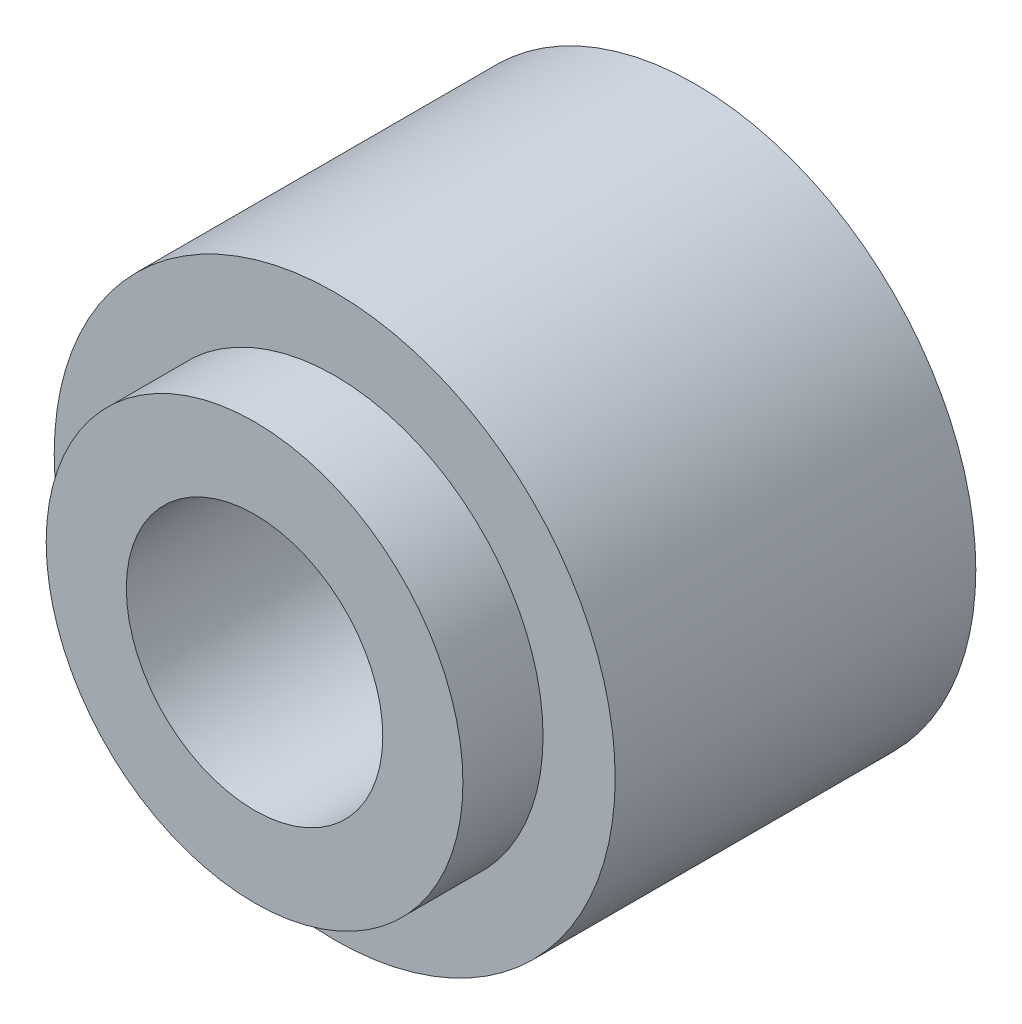
ISO-10303-21;
HEADER;
FILE_DESCRIPTION(('STEP AP214'),'2;1');
FILE_NAME('part.step','',(''),(''),'','','');
FILE_SCHEMA(('AUTOMOTIVE_DESIGN { 1 0 10303 214 1 1 1 1 }'));
ENDSEC;
DATA;
#1=APPLICATION_CONTEXT('core data for automotive mechanical design processes');
#2=APPLICATION_PROTOCOL_DEFINITION('international standard','automotive_design',2000,#1);
#3=PRODUCT_CONTEXT('',#1,'mechanical');
#4=PRODUCT('Part','Part','',(#3));
#5=PRODUCT_RELATED_PRODUCT_CATEGORY('part','',(#4));
#6=PRODUCT_DEFINITION_FORMATION('','',#4);
#7=PRODUCT_DEFINITION_CONTEXT('part definition',#1,'design');
#8=PRODUCT_DEFINITION('design','',#6,#7);
#9=PRODUCT_DEFINITION_SHAPE('','',#8);
#10=(LENGTH_UNIT() NAMED_UNIT(*) SI_UNIT(.MILLI.,.METRE.));
#11=(NAMED_UNIT(*) PLANE_ANGLE_UNIT() SI_UNIT($,.RADIAN.));
#12=(NAMED_UNIT(*) SI_UNIT($,.STERADIAN.) SOLID_ANGLE_UNIT());
#13=UNCERTAINTY_MEASURE_WITH_UNIT(LENGTH_MEASURE(1.E-05),#10,'distance_accuracy_value','');
#14=(GEOMETRIC_REPRESENTATION_CONTEXT(3) GLOBAL_UNCERTAINTY_ASSIGNED_CONTEXT((#13)) GLOBAL_UNIT_ASSIGNED_CONTEXT((#10,
#11,#12)) REPRESENTATION_CONTEXT('',''));
#15=CARTESIAN_POINT('',(0.,0.,0.));
#16=DIRECTION('',(0.,0.,1.));
#17=DIRECTION('',(1.,0.,0.));
#18=AXIS2_PLACEMENT_3D('',#15,#16,#17);
#19=CARTESIAN_POINT('',(0.,0.,5.5));
#20=DIRECTION('',(0.,0.,1.));
#21=DIRECTION('',(1.,0.,0.));
#22=AXIS2_PLACEMENT_3D('',#19,#20,#21);
#23=PLANE('',#22);
#24=CARTESIAN_POINT('',(0.,0.,5.5));
#25=DIRECTION('',(0.,0.,1.));
#26=DIRECTION('',(1.,0.,0.));
#27=AXIS2_PLACEMENT_3D('',#24,#25,#26);
#28=CIRCLE('',#27,1.6);
#29=CARTESIAN_POINT('',(1.6,0.,5.5));
#30=VERTEX_POINT('',#29);
#31=EDGE_CURVE('E42',#30,#30,#28,.T.);
#32=ORIENTED_EDGE('',*,*,#31,.F.);
#33=EDGE_LOOP('',(#32));
#34=FACE_BOUND('',#33,.T.);
#35=CARTESIAN_POINT('',(0.,0.,5.5));
#36=DIRECTION('',(0.,0.,1.));
#37=DIRECTION('',(1.,0.,0.));
#38=AXIS2_PLACEMENT_3D('',#35,#36,#37);
#39=CIRCLE('',#38,2.6);
#40=CARTESIAN_POINT('',(2.6,0.,5.5));
#41=VERTEX_POINT('',#40);
#42=EDGE_CURVE('E51',#41,#41,#39,.T.);
#43=ORIENTED_EDGE('',*,*,#42,.T.);
#44=EDGE_LOOP('',(#43));
#45=FACE_BOUND('',#44,.T.);
#46=ADVANCED_FACE('F34',(#34,#45),#23,.T.);
#47=CARTESIAN_POINT('',(0.,0.,5.5));
#48=DIRECTION('',(0.,0.,-1.));
#49=DIRECTION('',(-1.,0.,0.));
#50=AXIS2_PLACEMENT_3D('',#47,#48,#49);
#51=CYLINDRICAL_SURFACE('',#50,3.5);
#52=CARTESIAN_POINT('',(0.,0.,0.));
#53=DIRECTION('',(0.,0.,1.));
#54=DIRECTION('',(1.,0.,0.));
#55=AXIS2_PLACEMENT_3D('',#52,#53,#54);
#56=CIRCLE('',#55,3.5);
#57=CARTESIAN_POINT('',(3.5,0.,0.));
#58=VERTEX_POINT('',#57);
#59=EDGE_CURVE('E11',#58,#58,#56,.T.);
#60=ORIENTED_EDGE('',*,*,#59,.T.);
#61=EDGE_LOOP('',(#60));
#62=FACE_BOUND('',#61,.T.);
#63=CARTESIAN_POINT('',(0.,0.,4.5));
#64=DIRECTION('',(0.,0.,1.));
#65=DIRECTION('',(1.,0.,0.));
#66=AXIS2_PLACEMENT_3D('',#63,#64,#65);
#67=CIRCLE('',#66,3.5);
#68=CARTESIAN_POINT('',(3.5,0.,4.5));
#69=VERTEX_POINT('',#68);
#70=EDGE_CURVE('E38',#69,#69,#67,.T.);
#71=ORIENTED_EDGE('',*,*,#70,.F.);
#72=EDGE_LOOP('',(#71));
#73=FACE_BOUND('',#72,.T.);
#74=ADVANCED_FACE('F36',(#62,#73),#51,.T.);
#75=CARTESIAN_POINT('',(0.,0.,0.));
#76=DIRECTION('',(0.,0.,1.));
#77=DIRECTION('',(1.,0.,0.));
#78=AXIS2_PLACEMENT_3D('',#75,#76,#77);
#79=PLANE('',#78);
#80=ORIENTED_EDGE('',*,*,#59,.F.);
#81=EDGE_LOOP('',(#80));
#82=FACE_BOUND('',#81,.T.);
#83=CARTESIAN_POINT('',(0.,0.,0.));
#84=DIRECTION('',(0.,0.,1.));
#85=DIRECTION('',(1.,0.,0.));
#86=AXIS2_PLACEMENT_3D('',#83,#84,#85);
#87=CIRCLE('',#86,1.6);
#88=CARTESIAN_POINT('',(1.6,0.,0.));
#89=VERTEX_POINT('',#88);
#90=EDGE_CURVE('E46',#89,#89,#87,.T.);
#91=ORIENTED_EDGE('',*,*,#90,.T.);
#92=EDGE_LOOP('',(#91));
#93=FACE_BOUND('',#92,.T.);
#94=ADVANCED_FACE('F64',(#82,#93),#79,.F.);
#95=CARTESIAN_POINT('',(0.,0.,5.5));
#96=DIRECTION('',(0.,0.,-1.));
#97=DIRECTION('',(-1.,0.,0.));
#98=AXIS2_PLACEMENT_3D('',#95,#96,#97);
#99=CYLINDRICAL_SURFACE('',#98,1.6);
#100=ORIENTED_EDGE('',*,*,#31,.T.);
#101=EDGE_LOOP('',(#100));
#102=FACE_BOUND('',#101,.T.);
#103=ORIENTED_EDGE('',*,*,#90,.F.);
#104=EDGE_LOOP('',(#103));
#105=FACE_BOUND('',#104,.T.);
#106=ADVANCED_FACE('F69',(#102,#105),#99,.F.);
#107=CARTESIAN_POINT('',(0.,0.,4.5));
#108=DIRECTION('',(0.,0.,1.));
#109=DIRECTION('',(1.,0.,0.));
#110=AXIS2_PLACEMENT_3D('',#107,#108,#109);
#111=PLANE('',#110);
#112=CARTESIAN_POINT('',(0.,0.,4.5));
#113=DIRECTION('',(0.,0.,1.));
#114=DIRECTION('',(1.,0.,0.));
#115=AXIS2_PLACEMENT_3D('',#112,#113,#114);
#116=CIRCLE('',#115,2.6);
#117=CARTESIAN_POINT('',(2.6,0.,4.5));
#118=VERTEX_POINT('',#117);
#119=EDGE_CURVE('E54',#118,#118,#116,.T.);
#120=ORIENTED_EDGE('',*,*,#119,.F.);
#121=EDGE_LOOP('',(#120));
#122=FACE_BOUND('',#121,.T.);
#123=ORIENTED_EDGE('',*,*,#70,.T.);
#124=EDGE_LOOP('',(#123));
#125=FACE_BOUND('',#124,.T.);
#126=ADVANCED_FACE('F61',(#122,#125),#111,.T.);
#127=CARTESIAN_POINT('',(0.,0.,4.5));
#128=DIRECTION('',(0.,0.,1.));
#129=DIRECTION('',(1.,0.,0.));
#130=AXIS2_PLACEMENT_3D('',#127,#128,#129);
#131=CYLINDRICAL_SURFACE('',#130,2.6);
#132=ORIENTED_EDGE('',*,*,#119,.T.);
#133=EDGE_LOOP('',(#132));
#134=FACE_BOUND('',#133,.T.);
#135=ORIENTED_EDGE('',*,*,#42,.F.);
#136=EDGE_LOOP('',(#135));
#137=FACE_BOUND('',#136,.T.);
#138=ADVANCED_FACE('F83',(#134,#137),#131,.T.);
#139=CLOSED_SHELL('',(#46,#74,#94,#106,#126,#138));
#140=MANIFOLD_SOLID_BREP('B2',#139);
#141=ADVANCED_BREP_SHAPE_REPRESENTATION('',(#18,#140),#14);
#142=SHAPE_DEFINITION_REPRESENTATION(#9,#141);
ENDSEC;
END-ISO-10303-21;
